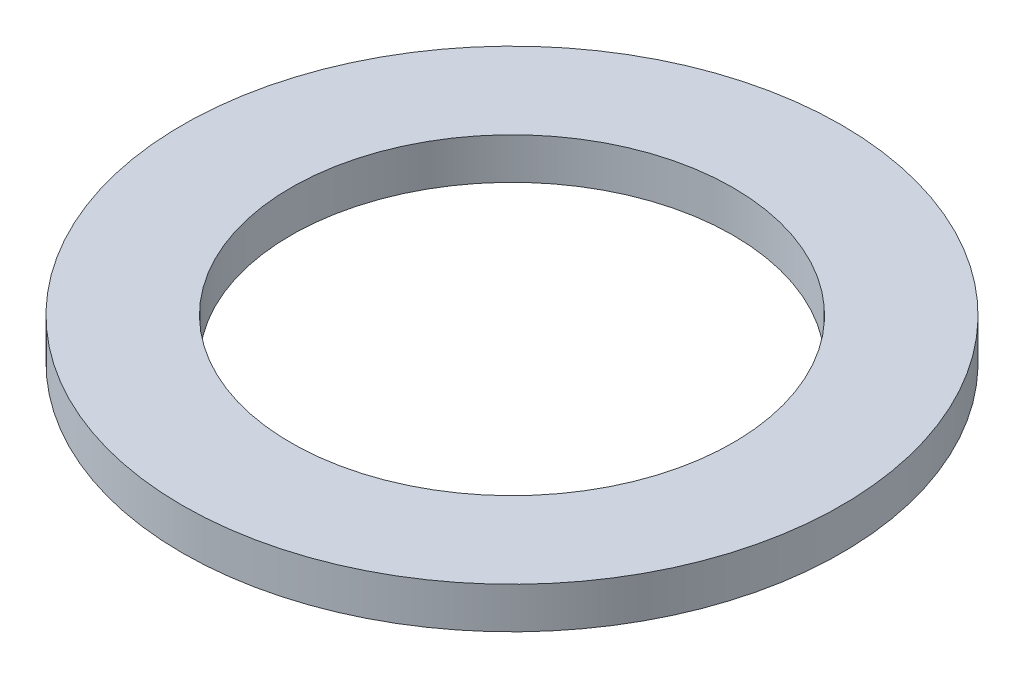
ISO-10303-21;
HEADER;
FILE_DESCRIPTION(('STEP AP214'),'2;1');
FILE_NAME('part.step','',(''),(''),'','','');
FILE_SCHEMA(('AUTOMOTIVE_DESIGN { 1 0 10303 214 1 1 1 1 }'));
ENDSEC;
DATA;
#1=APPLICATION_CONTEXT('core data for automotive mechanical design processes');
#2=APPLICATION_PROTOCOL_DEFINITION('international standard','automotive_design',2000,#1);
#3=PRODUCT_CONTEXT('',#1,'mechanical');
#4=PRODUCT('Part','Part','',(#3));
#5=PRODUCT_RELATED_PRODUCT_CATEGORY('part','',(#4));
#6=PRODUCT_DEFINITION_FORMATION('','',#4);
#7=PRODUCT_DEFINITION_CONTEXT('part definition',#1,'design');
#8=PRODUCT_DEFINITION('design','',#6,#7);
#9=PRODUCT_DEFINITION_SHAPE('','',#8);
#10=(LENGTH_UNIT() NAMED_UNIT(*) SI_UNIT(.MILLI.,.METRE.));
#11=(NAMED_UNIT(*) PLANE_ANGLE_UNIT() SI_UNIT($,.RADIAN.));
#12=(NAMED_UNIT(*) SI_UNIT($,.STERADIAN.) SOLID_ANGLE_UNIT());
#13=UNCERTAINTY_MEASURE_WITH_UNIT(LENGTH_MEASURE(1.E-05),#10,'distance_accuracy_value','');
#14=(GEOMETRIC_REPRESENTATION_CONTEXT(3) GLOBAL_UNCERTAINTY_ASSIGNED_CONTEXT((#13)) GLOBAL_UNIT_ASSIGNED_CONTEXT((#10,
#11,#12)) REPRESENTATION_CONTEXT('',''));
#15=CARTESIAN_POINT('',(0.,0.,0.));
#16=DIRECTION('',(0.,0.,1.));
#17=DIRECTION('',(1.,0.,0.));
#18=AXIS2_PLACEMENT_3D('',#15,#16,#17);
#19=CARTESIAN_POINT('',(0.,9.525,0.));
#20=DIRECTION('',(0.,1.,0.));
#21=DIRECTION('',(0.,0.,1.));
#22=AXIS2_PLACEMENT_3D('',#19,#20,#21);
#23=PLANE('',#22);
#24=CARTESIAN_POINT('',(0.,9.525,0.));
#25=DIRECTION('',(0.,1.,0.));
#26=DIRECTION('',(0.,0.,1.));
#27=AXIS2_PLACEMENT_3D('',#24,#25,#26);
#28=CIRCLE('',#27,76.2);
#29=CARTESIAN_POINT('',(0.,9.525,-76.2));
#30=VERTEX_POINT('',#29);
#31=EDGE_CURVE('E10',#30,#30,#28,.T.);
#32=ORIENTED_EDGE('',*,*,#31,.T.);
#33=EDGE_LOOP('',(#32));
#34=FACE_BOUND('',#33,.T.);
#35=CARTESIAN_POINT('',(0.,9.525,0.));
#36=DIRECTION('',(0.,1.,0.));
#37=DIRECTION('',(0.,0.,1.));
#38=AXIS2_PLACEMENT_3D('',#35,#36,#37);
#39=CIRCLE('',#38,51.1048);
#40=CARTESIAN_POINT('',(0.,9.525,-51.1048));
#41=VERTEX_POINT('',#40);
#42=EDGE_CURVE('E52',#41,#41,#39,.T.);
#43=ORIENTED_EDGE('',*,*,#42,.F.);
#44=EDGE_LOOP('',(#43));
#45=FACE_BOUND('',#44,.T.);
#46=ADVANCED_FACE('F41',(#34,#45),#23,.T.);
#47=CARTESIAN_POINT('',(0.,0.,0.));
#48=DIRECTION('',(0.,1.,0.));
#49=DIRECTION('',(0.,0.,1.));
#50=AXIS2_PLACEMENT_3D('',#47,#48,#49);
#51=PLANE('',#50);
#52=CARTESIAN_POINT('',(0.,0.,0.));
#53=DIRECTION('',(0.,1.,0.));
#54=DIRECTION('',(0.,0.,1.));
#55=AXIS2_PLACEMENT_3D('',#52,#53,#54);
#56=CIRCLE('',#55,76.2);
#57=CARTESIAN_POINT('',(0.,0.,-76.2));
#58=VERTEX_POINT('',#57);
#59=EDGE_CURVE('E45',#58,#58,#56,.T.);
#60=ORIENTED_EDGE('',*,*,#59,.F.);
#61=EDGE_LOOP('',(#60));
#62=FACE_BOUND('',#61,.T.);
#63=CARTESIAN_POINT('',(0.,0.,0.));
#64=DIRECTION('',(0.,1.,0.));
#65=DIRECTION('',(0.,0.,1.));
#66=AXIS2_PLACEMENT_3D('',#63,#64,#65);
#67=CIRCLE('',#66,51.1048);
#68=CARTESIAN_POINT('',(0.,0.,-51.1048));
#69=VERTEX_POINT('',#68);
#70=EDGE_CURVE('E54',#69,#69,#67,.T.);
#71=ORIENTED_EDGE('',*,*,#70,.T.);
#72=EDGE_LOOP('',(#71));
#73=FACE_BOUND('',#72,.T.);
#74=ADVANCED_FACE('F64',(#62,#73),#51,.F.);
#75=CARTESIAN_POINT('',(0.,9.525,0.));
#76=DIRECTION('',(0.,-1.,0.));
#77=DIRECTION('',(0.,0.,-1.));
#78=AXIS2_PLACEMENT_3D('',#75,#76,#77);
#79=CYLINDRICAL_SURFACE('',#78,76.2);
#80=CARTESIAN_POINT('',(0.,9.525,-76.2));
#81=CARTESIAN_POINT('',(0.,9.42578125,-76.2));
#82=CARTESIAN_POINT('',(0.,9.3265625,-76.2));
#83=CARTESIAN_POINT('',(0.,9.128125,-76.2));
#84=CARTESIAN_POINT('',(0.,9.02890625,-76.2));
#85=CARTESIAN_POINT('',(0.,8.83046875,-76.2));
#86=CARTESIAN_POINT('',(0.,8.73125,-76.2));
#87=CARTESIAN_POINT('',(0.,8.5328125,-76.2));
#88=CARTESIAN_POINT('',(0.,8.43359375,-76.2));
#89=CARTESIAN_POINT('',(0.,8.23515625,-76.2));
#90=CARTESIAN_POINT('',(0.,8.1359375,-76.2));
#91=CARTESIAN_POINT('',(0.,7.9375,-76.2));
#92=CARTESIAN_POINT('',(0.,7.83828125,-76.2));
#93=CARTESIAN_POINT('',(0.,7.63984375,-76.2));
#94=CARTESIAN_POINT('',(0.,7.540625,-76.2));
#95=CARTESIAN_POINT('',(0.,7.3421875,-76.2));
#96=CARTESIAN_POINT('',(0.,7.24296875,-76.2));
#97=CARTESIAN_POINT('',(0.,7.04453125,-76.2));
#98=CARTESIAN_POINT('',(0.,6.9453125,-76.2));
#99=CARTESIAN_POINT('',(0.,6.746875,-76.2));
#100=CARTESIAN_POINT('',(0.,6.64765625,-76.2));
#101=CARTESIAN_POINT('',(0.,6.44921875,-76.2));
#102=CARTESIAN_POINT('',(0.,6.35,-76.2));
#103=CARTESIAN_POINT('',(0.,6.1515625,-76.2));
#104=CARTESIAN_POINT('',(0.,6.05234375,-76.2));
#105=CARTESIAN_POINT('',(0.,5.85390625,-76.2));
#106=CARTESIAN_POINT('',(0.,5.7546875,-76.2));
#107=CARTESIAN_POINT('',(0.,5.55625,-76.2));
#108=CARTESIAN_POINT('',(0.,5.45703125,-76.2));
#109=CARTESIAN_POINT('',(0.,5.25859375,-76.2));
#110=CARTESIAN_POINT('',(0.,5.159375,-76.2));
#111=CARTESIAN_POINT('',(0.,4.9609375,-76.2));
#112=CARTESIAN_POINT('',(0.,4.86171875,-76.2));
#113=CARTESIAN_POINT('',(0.,4.66328125,-76.2));
#114=CARTESIAN_POINT('',(0.,4.5640625,-76.2));
#115=CARTESIAN_POINT('',(0.,4.365625,-76.2));
#116=CARTESIAN_POINT('',(0.,4.26640625,-76.2));
#117=CARTESIAN_POINT('',(0.,4.06796875,-76.2));
#118=CARTESIAN_POINT('',(0.,3.96875,-76.2));
#119=CARTESIAN_POINT('',(0.,3.7703125,-76.2));
#120=CARTESIAN_POINT('',(0.,3.67109375,-76.2));
#121=CARTESIAN_POINT('',(0.,3.47265625,-76.2));
#122=CARTESIAN_POINT('',(0.,3.3734375,-76.2));
#123=CARTESIAN_POINT('',(0.,3.175,-76.2));
#124=CARTESIAN_POINT('',(0.,3.07578125,-76.2));
#125=CARTESIAN_POINT('',(0.,2.87734375,-76.2));
#126=CARTESIAN_POINT('',(0.,2.778125,-76.2));
#127=CARTESIAN_POINT('',(0.,2.5796875,-76.2));
#128=CARTESIAN_POINT('',(0.,2.48046875,-76.2));
#129=CARTESIAN_POINT('',(0.,2.28203125,-76.2));
#130=CARTESIAN_POINT('',(0.,2.1828125,-76.2));
#131=CARTESIAN_POINT('',(0.,1.984375,-76.2));
#132=CARTESIAN_POINT('',(0.,1.88515625,-76.2));
#133=CARTESIAN_POINT('',(0.,1.68671875,-76.2));
#134=CARTESIAN_POINT('',(0.,1.5875,-76.2));
#135=CARTESIAN_POINT('',(0.,1.3890625,-76.2));
#136=CARTESIAN_POINT('',(0.,1.28984375,-76.2));
#137=CARTESIAN_POINT('',(0.,1.09140625,-76.2));
#138=CARTESIAN_POINT('',(0.,0.992187500000001,-76.2));
#139=CARTESIAN_POINT('',(0.,0.793750000000001,-76.2));
#140=CARTESIAN_POINT('',(0.,0.69453125,-76.2));
#141=CARTESIAN_POINT('',(0.,0.49609375,-76.2));
#142=CARTESIAN_POINT('',(0.,0.396875,-76.2));
#143=CARTESIAN_POINT('',(0.,0.1984375,-76.2));
#144=CARTESIAN_POINT('',(0.,0.0992187500000001,-76.2));
#145=CARTESIAN_POINT('',(0.,0.,-76.2));
#146=B_SPLINE_CURVE_WITH_KNOTS('',3,(#80,#81,#82,#83,#84,#85,#86,#87,#88,#89,#90,#91,#92,#93,
#94,#95,#96,#97,#98,#99,#100,#101,#102,#103,#104,#105,#106,#107,#108,#109,#110,#111,#112,#113,
#114,#115,#116,#117,#118,#119,#120,#121,#122,#123,#124,#125,#126,#127,#128,#129,#130,#131,#132,
#133,#134,#135,#136,#137,#138,#139,#140,#141,#142,#143,#144,#145),.UNSPECIFIED.,.F.,.F.,(4,2,2,
2,2,2,2,2,2,2,2,2,2,2,2,2,2,2,2,2,2,2,2,2,2,2,2,2,2,2,2,2,4),(0.,0.29765625,0.5953125,
0.892968750000001,1.190625,1.48828125,1.7859375,2.08359375,2.38125,2.67890625,2.9765625,
3.27421875,3.571875,3.86953125,4.1671875,4.46484375,4.7625,5.06015625,5.3578125,5.65546875,
5.953125,6.25078125,6.5484375,6.84609375,7.14375,7.44140625,7.7390625,8.03671875,8.334375,
8.63203125,8.9296875,9.22734375,9.525),.UNSPECIFIED.);
#147=EDGE_CURVE('BSEAM43',#30,#58,#146,.T.);
#148=ORIENTED_EDGE('',*,*,#31,.F.);
#149=ORIENTED_EDGE('',*,*,#59,.T.);
#150=ORIENTED_EDGE('',*,*,#147,.T.);
#151=ORIENTED_EDGE('',*,*,#147,.F.);
#152=EDGE_LOOP('',(#148,#150,#149,#151));
#153=FACE_BOUND('',#152,.T.);
#154=ADVANCED_FACE('F43',(#153),#79,.T.);
#155=CARTESIAN_POINT('',(0.,9.525,0.));
#156=DIRECTION('',(0.,-1.,0.));
#157=DIRECTION('',(0.,0.,-1.));
#158=AXIS2_PLACEMENT_3D('',#155,#156,#157);
#159=CYLINDRICAL_SURFACE('',#158,51.1048);
#160=CARTESIAN_POINT('',(0.,9.525,-51.1048));
#161=CARTESIAN_POINT('',(0.,9.42578125,-51.1048));
#162=CARTESIAN_POINT('',(0.,9.3265625,-51.1048));
#163=CARTESIAN_POINT('',(0.,9.128125,-51.1048));
#164=CARTESIAN_POINT('',(0.,9.02890625,-51.1048));
#165=CARTESIAN_POINT('',(0.,8.83046875,-51.1048));
#166=CARTESIAN_POINT('',(0.,8.73125,-51.1048));
#167=CARTESIAN_POINT('',(0.,8.5328125,-51.1048));
#168=CARTESIAN_POINT('',(0.,8.43359375,-51.1048));
#169=CARTESIAN_POINT('',(0.,8.23515625,-51.1048));
#170=CARTESIAN_POINT('',(0.,8.1359375,-51.1048));
#171=CARTESIAN_POINT('',(0.,7.9375,-51.1048));
#172=CARTESIAN_POINT('',(0.,7.83828125,-51.1048));
#173=CARTESIAN_POINT('',(0.,7.63984375,-51.1048));
#174=CARTESIAN_POINT('',(0.,7.540625,-51.1048));
#175=CARTESIAN_POINT('',(0.,7.3421875,-51.1048));
#176=CARTESIAN_POINT('',(0.,7.24296875,-51.1048));
#177=CARTESIAN_POINT('',(0.,7.04453125,-51.1048));
#178=CARTESIAN_POINT('',(0.,6.9453125,-51.1048));
#179=CARTESIAN_POINT('',(0.,6.746875,-51.1048));
#180=CARTESIAN_POINT('',(0.,6.64765625,-51.1048));
#181=CARTESIAN_POINT('',(0.,6.44921875,-51.1048));
#182=CARTESIAN_POINT('',(0.,6.35,-51.1048));
#183=CARTESIAN_POINT('',(0.,6.1515625,-51.1048));
#184=CARTESIAN_POINT('',(0.,6.05234375,-51.1048));
#185=CARTESIAN_POINT('',(0.,5.85390625,-51.1048));
#186=CARTESIAN_POINT('',(0.,5.7546875,-51.1048));
#187=CARTESIAN_POINT('',(0.,5.55625,-51.1048));
#188=CARTESIAN_POINT('',(0.,5.45703125,-51.1048));
#189=CARTESIAN_POINT('',(0.,5.25859375,-51.1048));
#190=CARTESIAN_POINT('',(0.,5.159375,-51.1048));
#191=CARTESIAN_POINT('',(0.,4.9609375,-51.1048));
#192=CARTESIAN_POINT('',(0.,4.86171875,-51.1048));
#193=CARTESIAN_POINT('',(0.,4.66328125,-51.1048));
#194=CARTESIAN_POINT('',(0.,4.5640625,-51.1048));
#195=CARTESIAN_POINT('',(0.,4.365625,-51.1048));
#196=CARTESIAN_POINT('',(0.,4.26640625,-51.1048));
#197=CARTESIAN_POINT('',(0.,4.06796875,-51.1048));
#198=CARTESIAN_POINT('',(0.,3.96875,-51.1048));
#199=CARTESIAN_POINT('',(0.,3.7703125,-51.1048));
#200=CARTESIAN_POINT('',(0.,3.67109375,-51.1048));
#201=CARTESIAN_POINT('',(0.,3.47265625,-51.1048));
#202=CARTESIAN_POINT('',(0.,3.3734375,-51.1048));
#203=CARTESIAN_POINT('',(0.,3.175,-51.1048));
#204=CARTESIAN_POINT('',(0.,3.07578125,-51.1048));
#205=CARTESIAN_POINT('',(0.,2.87734375,-51.1048));
#206=CARTESIAN_POINT('',(0.,2.778125,-51.1048));
#207=CARTESIAN_POINT('',(0.,2.5796875,-51.1048));
#208=CARTESIAN_POINT('',(0.,2.48046875,-51.1048));
#209=CARTESIAN_POINT('',(0.,2.28203125,-51.1048));
#210=CARTESIAN_POINT('',(0.,2.1828125,-51.1048));
#211=CARTESIAN_POINT('',(0.,1.984375,-51.1048));
#212=CARTESIAN_POINT('',(0.,1.88515625,-51.1048));
#213=CARTESIAN_POINT('',(0.,1.68671875,-51.1048));
#214=CARTESIAN_POINT('',(0.,1.5875,-51.1048));
#215=CARTESIAN_POINT('',(0.,1.3890625,-51.1048));
#216=CARTESIAN_POINT('',(0.,1.28984375,-51.1048));
#217=CARTESIAN_POINT('',(0.,1.09140625,-51.1048));
#218=CARTESIAN_POINT('',(0.,0.992187500000001,-51.1048));
#219=CARTESIAN_POINT('',(0.,0.793750000000001,-51.1048));
#220=CARTESIAN_POINT('',(0.,0.69453125,-51.1048));
#221=CARTESIAN_POINT('',(0.,0.49609375,-51.1048));
#222=CARTESIAN_POINT('',(0.,0.396875,-51.1048));
#223=CARTESIAN_POINT('',(0.,0.1984375,-51.1048));
#224=CARTESIAN_POINT('',(0.,0.0992187500000001,-51.1048));
#225=CARTESIAN_POINT('',(0.,0.,-51.1048));
#226=B_SPLINE_CURVE_WITH_KNOTS('',3,(#160,#161,#162,#163,#164,#165,#166,#167,#168,#169,#170,
#171,#172,#173,#174,#175,#176,#177,#178,#179,#180,#181,#182,#183,#184,#185,#186,#187,#188,#189,
#190,#191,#192,#193,#194,#195,#196,#197,#198,#199,#200,#201,#202,#203,#204,#205,#206,#207,#208,
#209,#210,#211,#212,#213,#214,#215,#216,#217,#218,#219,#220,#221,#222,#223,#224,#225),
.UNSPECIFIED.,.F.,.F.,(4,2,2,2,2,2,2,2,2,2,2,2,2,2,2,2,2,2,2,2,2,2,2,2,2,2,2,2,2,2,2,2,4),(0.,
0.297656249999998,0.595312499999999,0.892968749999999,1.190625,1.48828125,1.7859375,2.08359375,
2.38125,2.67890625,2.9765625,3.27421875,3.571875,3.86953125,4.1671875,4.46484375,4.7625,
5.06015625,5.3578125,5.65546875,5.953125,6.25078125,6.5484375,6.84609375,7.14375,7.44140625,
7.7390625,8.03671875,8.334375,8.63203125,8.9296875,9.22734375,9.525),.UNSPECIFIED.);
#227=EDGE_CURVE('BSEAM60',#41,#69,#226,.T.);
#228=ORIENTED_EDGE('',*,*,#42,.T.);
#229=ORIENTED_EDGE('',*,*,#70,.F.);
#230=ORIENTED_EDGE('',*,*,#227,.T.);
#231=ORIENTED_EDGE('',*,*,#227,.F.);
#232=EDGE_LOOP('',(#228,#230,#229,#231));
#233=FACE_BOUND('',#232,.T.);
#234=ADVANCED_FACE('F60',(#233),#159,.F.);
#235=CLOSED_SHELL('',(#46,#74,#154,#234));
#236=MANIFOLD_SOLID_BREP('B2',#235);
#237=ADVANCED_BREP_SHAPE_REPRESENTATION('',(#18,#236),#14);
#238=SHAPE_DEFINITION_REPRESENTATION(#9,#237);
ENDSEC;
END-ISO-10303-21;
